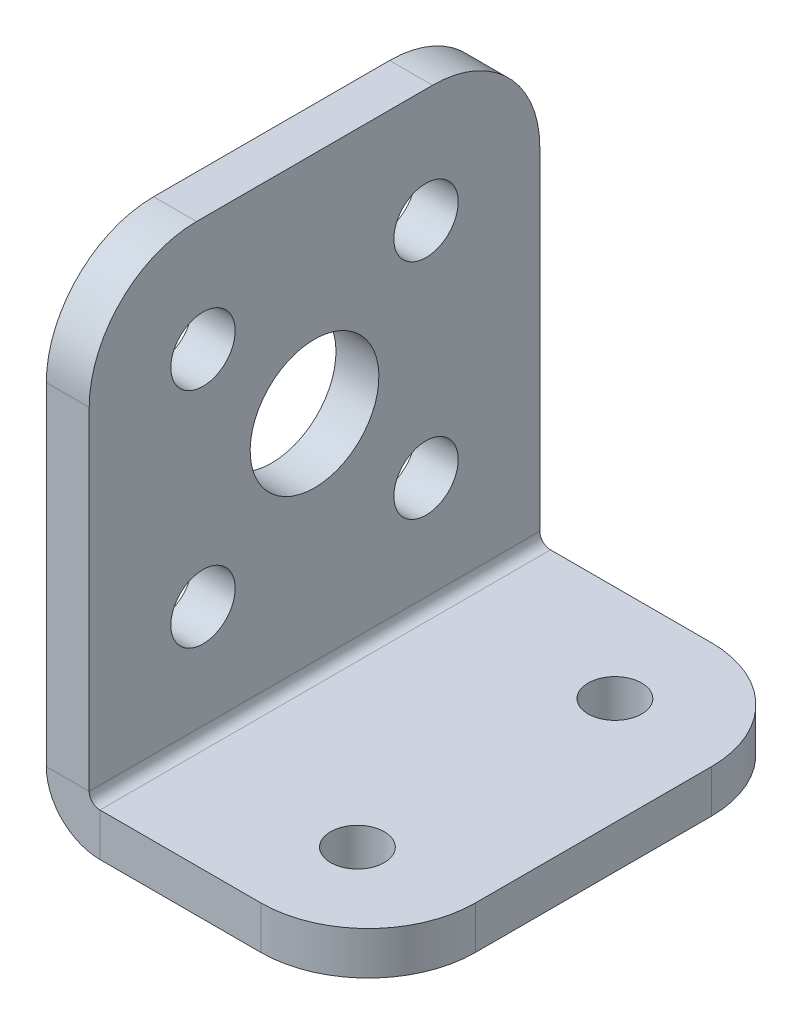
ISO-10303-21;
HEADER;
FILE_DESCRIPTION(('STEP AP214'),'2;1');
FILE_NAME('part.step','',(''),(''),'','','');
FILE_SCHEMA(('AUTOMOTIVE_DESIGN { 1 0 10303 214 1 1 1 1 }'));
ENDSEC;
DATA;
#1=APPLICATION_CONTEXT('core data for automotive mechanical design processes');
#2=APPLICATION_PROTOCOL_DEFINITION('international standard','automotive_design',2000,#1);
#3=PRODUCT_CONTEXT('',#1,'mechanical');
#4=PRODUCT('Part','Part','',(#3));
#5=PRODUCT_RELATED_PRODUCT_CATEGORY('part','',(#4));
#6=PRODUCT_DEFINITION_FORMATION('','',#4);
#7=PRODUCT_DEFINITION_CONTEXT('part definition',#1,'design');
#8=PRODUCT_DEFINITION('design','',#6,#7);
#9=PRODUCT_DEFINITION_SHAPE('','',#8);
#10=(LENGTH_UNIT() NAMED_UNIT(*) SI_UNIT(.MILLI.,.METRE.));
#11=(NAMED_UNIT(*) PLANE_ANGLE_UNIT() SI_UNIT($,.RADIAN.));
#12=(NAMED_UNIT(*) SI_UNIT($,.STERADIAN.) SOLID_ANGLE_UNIT());
#13=UNCERTAINTY_MEASURE_WITH_UNIT(LENGTH_MEASURE(1.E-05),#10,'distance_accuracy_value','');
#14=(GEOMETRIC_REPRESENTATION_CONTEXT(3) GLOBAL_UNCERTAINTY_ASSIGNED_CONTEXT((#13)) GLOBAL_UNIT_ASSIGNED_CONTEXT((#10,
#11,#12)) REPRESENTATION_CONTEXT('',''));
#15=CARTESIAN_POINT('',(0.,0.,0.));
#16=DIRECTION('',(0.,0.,1.));
#17=DIRECTION('',(1.,0.,0.));
#18=AXIS2_PLACEMENT_3D('',#15,#16,#17);
#19=CARTESIAN_POINT('',(-2.,10.25,10.5));
#20=DIRECTION('',(0.,0.,1.));
#21=DIRECTION('',(0.,-1.,0.));
#22=AXIS2_PLACEMENT_3D('',#19,#20,#21);
#23=PLANE('',#22);
#24=DIRECTION('',(0.,-1.,0.));
#25=VECTOR('',#24,1.);
#26=CARTESIAN_POINT('',(0.,10.25,10.5));
#27=LINE('',#26,#25);
#28=CARTESIAN_POINT('',(0.,5.25,10.5));
#29=VERTEX_POINT('',#28);
#30=CARTESIAN_POINT('',(0.,-10.25,10.5));
#31=VERTEX_POINT('',#30);
#32=EDGE_CURVE('E200',#29,#31,#27,.T.);
#33=ORIENTED_EDGE('',*,*,#32,.F.);
#34=DIRECTION('',(1.,0.,0.));
#35=VECTOR('',#34,1.);
#36=CARTESIAN_POINT('',(-2.,5.25,10.5));
#37=LINE('',#36,#35);
#38=CARTESIAN_POINT('',(-2.,5.25,10.5));
#39=VERTEX_POINT('',#38);
#40=EDGE_CURVE('E231',#29,#39,#37,.F.);
#41=ORIENTED_EDGE('',*,*,#40,.T.);
#42=DIRECTION('',(0.,-1.,0.));
#43=VECTOR('',#42,1.);
#44=CARTESIAN_POINT('',(-2.,10.25,10.5));
#45=LINE('',#44,#43);
#46=CARTESIAN_POINT('',(-2.,-10.25,10.5));
#47=VERTEX_POINT('',#46);
#48=EDGE_CURVE('E206',#39,#47,#45,.T.);
#49=ORIENTED_EDGE('',*,*,#48,.T.);
#50=DIRECTION('',(1.,0.,0.));
#51=VECTOR('',#50,1.);
#52=CARTESIAN_POINT('',(-2.,-10.25,10.5));
#53=LINE('',#52,#51);
#54=EDGE_CURVE('E218',#47,#31,#53,.T.);
#55=ORIENTED_EDGE('',*,*,#54,.T.);
#56=EDGE_LOOP('',(#33,#41,#49,#55));
#57=FACE_BOUND('',#56,.T.);
#58=ADVANCED_FACE('F54',(#57),#23,.T.);
#59=CARTESIAN_POINT('',(-2.,10.25,-10.5));
#60=DIRECTION('',(0.,1.,0.));
#61=DIRECTION('',(0.,0.,1.));
#62=AXIS2_PLACEMENT_3D('',#59,#60,#61);
#63=PLANE('',#62);
#64=DIRECTION('',(0.,0.,1.));
#65=VECTOR('',#64,1.);
#66=CARTESIAN_POINT('',(-2.,10.25,-10.5));
#67=LINE('',#66,#65);
#68=CARTESIAN_POINT('',(-2.,10.25,-5.49999999999999));
#69=VERTEX_POINT('',#68);
#70=CARTESIAN_POINT('',(-2.,10.25,5.5));
#71=VERTEX_POINT('',#70);
#72=EDGE_CURVE('E203',#69,#71,#67,.T.);
#73=ORIENTED_EDGE('',*,*,#72,.T.);
#74=DIRECTION('',(1.,0.,0.));
#75=VECTOR('',#74,1.);
#76=CARTESIAN_POINT('',(-2.,10.25,5.50000000000001));
#77=LINE('',#76,#75);
#78=CARTESIAN_POINT('',(0.,10.25,5.5));
#79=VERTEX_POINT('',#78);
#80=EDGE_CURVE('E224',#71,#79,#77,.T.);
#81=ORIENTED_EDGE('',*,*,#80,.T.);
#82=DIRECTION('',(0.,0.,1.));
#83=VECTOR('',#82,1.);
#84=CARTESIAN_POINT('',(0.,10.25,-10.5));
#85=LINE('',#84,#83);
#86=CARTESIAN_POINT('',(0.,10.25,-5.49999999999999));
#87=VERTEX_POINT('',#86);
#88=EDGE_CURVE('E214',#87,#79,#85,.T.);
#89=ORIENTED_EDGE('',*,*,#88,.F.);
#90=DIRECTION('',(1.,0.,0.));
#91=VECTOR('',#90,1.);
#92=CARTESIAN_POINT('',(-2.,10.25,-5.49999999999999));
#93=LINE('',#92,#91);
#94=EDGE_CURVE('E221',#87,#69,#93,.F.);
#95=ORIENTED_EDGE('',*,*,#94,.T.);
#96=EDGE_LOOP('',(#73,#81,#89,#95));
#97=FACE_BOUND('',#96,.T.);
#98=ADVANCED_FACE('F294',(#97),#63,.T.);
#99=CARTESIAN_POINT('',(-2.,10.25,-10.5));
#100=DIRECTION('',(0.,0.,-1.));
#101=DIRECTION('',(0.,1.,0.));
#102=AXIS2_PLACEMENT_3D('',#99,#100,#101);
#103=PLANE('',#102);
#104=DIRECTION('',(0.,1.,0.));
#105=VECTOR('',#104,1.);
#106=CARTESIAN_POINT('',(-2.,10.25,-10.5));
#107=LINE('',#106,#105);
#108=CARTESIAN_POINT('',(-2.,-10.25,-10.5));
#109=VERTEX_POINT('',#108);
#110=CARTESIAN_POINT('',(-2.,5.25,-10.5));
#111=VERTEX_POINT('',#110);
#112=EDGE_CURVE('E199',#109,#111,#107,.T.);
#113=ORIENTED_EDGE('',*,*,#112,.T.);
#114=DIRECTION('',(1.,0.,0.));
#115=VECTOR('',#114,1.);
#116=CARTESIAN_POINT('',(-2.,5.25,-10.5));
#117=LINE('',#116,#115);
#118=CARTESIAN_POINT('',(0.,5.25,-10.5));
#119=VERTEX_POINT('',#118);
#120=EDGE_CURVE('E237',#111,#119,#117,.T.);
#121=ORIENTED_EDGE('',*,*,#120,.T.);
#122=DIRECTION('',(0.,1.,0.));
#123=VECTOR('',#122,1.);
#124=CARTESIAN_POINT('',(0.,10.25,-10.5));
#125=LINE('',#124,#123);
#126=CARTESIAN_POINT('',(0.,-10.25,-10.5));
#127=VERTEX_POINT('',#126);
#128=EDGE_CURVE('E211',#127,#119,#125,.T.);
#129=ORIENTED_EDGE('',*,*,#128,.F.);
#130=DIRECTION('',(1.,0.,0.));
#131=VECTOR('',#130,1.);
#132=CARTESIAN_POINT('',(-2.,-10.25,-10.5));
#133=LINE('',#132,#131);
#134=EDGE_CURVE('E208',#109,#127,#133,.T.);
#135=ORIENTED_EDGE('',*,*,#134,.F.);
#136=EDGE_LOOP('',(#113,#121,#129,#135));
#137=FACE_BOUND('',#136,.T.);
#138=ADVANCED_FACE('F286',(#137),#103,.T.);
#139=CARTESIAN_POINT('',(-2.,0.,0.));
#140=DIRECTION('',(1.,0.,0.));
#141=DIRECTION('',(0.,0.,-1.));
#142=AXIS2_PLACEMENT_3D('',#139,#140,#141);
#143=PLANE('',#142);
#144=CARTESIAN_POINT('',(-2.,4.94723484172118,-5.19723484172109));
#145=DIRECTION('',(-1.,0.,0.));
#146=DIRECTION('',(0.,-1.,0.));
#147=AXIS2_PLACEMENT_3D('',#144,#145,#146);
#148=CIRCLE('',#147,1.4999999999996);
#149=CARTESIAN_POINT('',(-2.,3.44723484172158,-5.19723484172109));
#150=VERTEX_POINT('',#149);
#151=EDGE_CURVE('E384',#150,#150,#148,.T.);
#152=ORIENTED_EDGE('',*,*,#151,.F.);
#153=EDGE_LOOP('',(#152));
#154=FACE_BOUND('',#153,.T.);
#155=CARTESIAN_POINT('',(-2.,-5.44723484172109,-5.19723484172115));
#156=DIRECTION('',(-1.,0.,0.));
#157=DIRECTION('',(0.,-1.,0.));
#158=AXIS2_PLACEMENT_3D('',#155,#156,#157);
#159=CIRCLE('',#158,1.49999999999832);
#160=CARTESIAN_POINT('',(-2.,-6.94723484171941,-5.19723484172115));
#161=VERTEX_POINT('',#160);
#162=EDGE_CURVE('E408',#161,#161,#159,.T.);
#163=ORIENTED_EDGE('',*,*,#162,.F.);
#164=EDGE_LOOP('',(#163));
#165=FACE_BOUND('',#164,.T.);
#166=CARTESIAN_POINT('',(-2.,-5.44723484172111,5.19723484172111));
#167=DIRECTION('',(-1.,0.,0.));
#168=DIRECTION('',(0.,-1.,0.));
#169=AXIS2_PLACEMENT_3D('',#166,#167,#168);
#170=CIRCLE('',#169,1.49999999999871);
#171=CARTESIAN_POINT('',(-2.,-6.94723484171982,5.19723484172111));
#172=VERTEX_POINT('',#171);
#173=EDGE_CURVE('E402',#172,#172,#170,.T.);
#174=ORIENTED_EDGE('',*,*,#173,.F.);
#175=EDGE_LOOP('',(#174));
#176=FACE_BOUND('',#175,.T.);
#177=CARTESIAN_POINT('',(-2.,4.94723484172116,5.1972348417211));
#178=DIRECTION('',(-1.,0.,0.));
#179=DIRECTION('',(0.,-1.,0.));
#180=AXIS2_PLACEMENT_3D('',#177,#178,#179);
#181=CIRCLE('',#180,1.5);
#182=CARTESIAN_POINT('',(-2.,3.44723484172116,5.1972348417211));
#183=VERTEX_POINT('',#182);
#184=EDGE_CURVE('E396',#183,#183,#181,.T.);
#185=ORIENTED_EDGE('',*,*,#184,.F.);
#186=EDGE_LOOP('',(#185));
#187=FACE_BOUND('',#186,.T.);
#188=CARTESIAN_POINT('',(-2.,-0.249999999999993,0.));
#189=DIRECTION('',(-1.,0.,0.));
#190=DIRECTION('',(0.,-1.,0.));
#191=AXIS2_PLACEMENT_3D('',#188,#189,#190);
#192=CIRCLE('',#191,3.);
#193=CARTESIAN_POINT('',(-2.,-3.24999999999999,0.));
#194=VERTEX_POINT('',#193);
#195=EDGE_CURVE('E395',#194,#194,#192,.T.);
#196=ORIENTED_EDGE('',*,*,#195,.F.);
#197=EDGE_LOOP('',(#196));
#198=FACE_BOUND('',#197,.T.);
#199=ORIENTED_EDGE('',*,*,#48,.F.);
#200=CARTESIAN_POINT('',(-2.,5.25,5.50000000000001));
#201=DIRECTION('',(1.,0.,0.));
#202=DIRECTION('',(0.,0.,-1.));
#203=AXIS2_PLACEMENT_3D('',#200,#201,#202);
#204=CIRCLE('',#203,5.);
#205=EDGE_CURVE('E235',#39,#71,#204,.F.);
#206=ORIENTED_EDGE('',*,*,#205,.T.);
#207=ORIENTED_EDGE('',*,*,#72,.F.);
#208=CARTESIAN_POINT('',(-2.,5.25,-5.49999999999999));
#209=DIRECTION('',(1.,0.,0.));
#210=DIRECTION('',(0.,0.,-1.));
#211=AXIS2_PLACEMENT_3D('',#208,#209,#210);
#212=CIRCLE('',#211,5.);
#213=EDGE_CURVE('E233',#69,#111,#212,.F.);
#214=ORIENTED_EDGE('',*,*,#213,.T.);
#215=ORIENTED_EDGE('',*,*,#112,.F.);
#216=DIRECTION('',(0.,0.,-1.));
#217=VECTOR('',#216,1.);
#218=CARTESIAN_POINT('',(-2.,-10.25,-10.5));
#219=LINE('',#218,#217);
#220=EDGE_CURVE('E155',#47,#109,#219,.T.);
#221=ORIENTED_EDGE('',*,*,#220,.F.);
#222=EDGE_LOOP('',(#199,#206,#207,#214,#215,#221));
#223=FACE_BOUND('',#222,.T.);
#224=ADVANCED_FACE('F280',(#154,#165,#176,#187,#198,#223),#143,.F.);
#225=CARTESIAN_POINT('',(0.,0.,0.));
#226=DIRECTION('',(1.,0.,0.));
#227=DIRECTION('',(0.,0.,-1.));
#228=AXIS2_PLACEMENT_3D('',#225,#226,#227);
#229=PLANE('',#228);
#230=CARTESIAN_POINT('',(0.,4.94723484172118,-5.19723484172109));
#231=DIRECTION('',(-1.,0.,0.));
#232=DIRECTION('',(0.,-1.,0.));
#233=AXIS2_PLACEMENT_3D('',#230,#231,#232);
#234=CIRCLE('',#233,1.4999999999996);
#235=CARTESIAN_POINT('',(0.,3.44723484172158,-5.19723484172109));
#236=VERTEX_POINT('',#235);
#237=EDGE_CURVE('E411',#236,#236,#234,.T.);
#238=ORIENTED_EDGE('',*,*,#237,.T.);
#239=EDGE_LOOP('',(#238));
#240=FACE_BOUND('',#239,.T.);
#241=CARTESIAN_POINT('',(0.,-5.44723484172109,-5.19723484172115));
#242=DIRECTION('',(-1.,0.,0.));
#243=DIRECTION('',(0.,-1.,0.));
#244=AXIS2_PLACEMENT_3D('',#241,#242,#243);
#245=CIRCLE('',#244,1.49999999999832);
#246=CARTESIAN_POINT('',(0.,-6.94723484171941,-5.19723484172115));
#247=VERTEX_POINT('',#246);
#248=EDGE_CURVE('E405',#247,#247,#245,.T.);
#249=ORIENTED_EDGE('',*,*,#248,.T.);
#250=EDGE_LOOP('',(#249));
#251=FACE_BOUND('',#250,.T.);
#252=CARTESIAN_POINT('',(0.,-5.44723484172111,5.19723484172111));
#253=DIRECTION('',(-1.,0.,0.));
#254=DIRECTION('',(0.,-1.,0.));
#255=AXIS2_PLACEMENT_3D('',#252,#253,#254);
#256=CIRCLE('',#255,1.49999999999871);
#257=CARTESIAN_POINT('',(0.,-6.94723484171982,5.19723484172111));
#258=VERTEX_POINT('',#257);
#259=EDGE_CURVE('E399',#258,#258,#256,.T.);
#260=ORIENTED_EDGE('',*,*,#259,.T.);
#261=EDGE_LOOP('',(#260));
#262=FACE_BOUND('',#261,.T.);
#263=CARTESIAN_POINT('',(0.,4.94723484172116,5.1972348417211));
#264=DIRECTION('',(-1.,0.,0.));
#265=DIRECTION('',(0.,-1.,0.));
#266=AXIS2_PLACEMENT_3D('',#263,#264,#265);
#267=CIRCLE('',#266,1.5);
#268=CARTESIAN_POINT('',(0.,3.44723484172116,5.1972348417211));
#269=VERTEX_POINT('',#268);
#270=EDGE_CURVE('E392',#269,#269,#267,.T.);
#271=ORIENTED_EDGE('',*,*,#270,.T.);
#272=EDGE_LOOP('',(#271));
#273=FACE_BOUND('',#272,.T.);
#274=CARTESIAN_POINT('',(0.,-0.249999999999993,0.));
#275=DIRECTION('',(-1.,0.,0.));
#276=DIRECTION('',(0.,-1.,0.));
#277=AXIS2_PLACEMENT_3D('',#274,#275,#276);
#278=CIRCLE('',#277,3.);
#279=CARTESIAN_POINT('',(0.,-3.24999999999999,0.));
#280=VERTEX_POINT('',#279);
#281=EDGE_CURVE('E192',#280,#280,#278,.T.);
#282=ORIENTED_EDGE('',*,*,#281,.T.);
#283=EDGE_LOOP('',(#282));
#284=FACE_BOUND('',#283,.T.);
#285=ORIENTED_EDGE('',*,*,#88,.T.);
#286=CARTESIAN_POINT('',(0.,5.25,5.50000000000001));
#287=DIRECTION('',(1.,0.,0.));
#288=DIRECTION('',(0.,0.,-1.));
#289=AXIS2_PLACEMENT_3D('',#286,#287,#288);
#290=CIRCLE('',#289,5.);
#291=EDGE_CURVE('E229',#79,#29,#290,.T.);
#292=ORIENTED_EDGE('',*,*,#291,.T.);
#293=ORIENTED_EDGE('',*,*,#32,.T.);
#294=DIRECTION('',(0.,0.,-1.));
#295=VECTOR('',#294,1.);
#296=CARTESIAN_POINT('',(0.,-10.25,-10.5));
#297=LINE('',#296,#295);
#298=EDGE_CURVE('E193',#31,#127,#297,.T.);
#299=ORIENTED_EDGE('',*,*,#298,.T.);
#300=ORIENTED_EDGE('',*,*,#128,.T.);
#301=CARTESIAN_POINT('',(0.,5.25,-5.49999999999999));
#302=DIRECTION('',(1.,0.,0.));
#303=DIRECTION('',(0.,0.,-1.));
#304=AXIS2_PLACEMENT_3D('',#301,#302,#303);
#305=CIRCLE('',#304,5.);
#306=EDGE_CURVE('E227',#119,#87,#305,.T.);
#307=ORIENTED_EDGE('',*,*,#306,.T.);
#308=EDGE_LOOP('',(#285,#292,#293,#299,#300,#307));
#309=FACE_BOUND('',#308,.T.);
#310=ADVANCED_FACE('F288',(#240,#251,#262,#273,#284,#309),#229,.T.);
#311=CARTESIAN_POINT('',(0.5,-10.25,10.5));
#312=DIRECTION('',(0.,0.,1.));
#313=DIRECTION('',(1.,0.,0.));
#314=AXIS2_PLACEMENT_3D('',#311,#312,#313);
#315=PLANE('',#314);
#316=DIRECTION('',(0.,1.,0.));
#317=VECTOR('',#316,1.);
#318=CARTESIAN_POINT('',(0.499999999999992,-12.75,10.5));
#319=LINE('',#318,#317);
#320=CARTESIAN_POINT('',(0.499999999999999,-10.75,10.5));
#321=VERTEX_POINT('',#320);
#322=CARTESIAN_POINT('',(0.499999999999992,-12.75,10.5));
#323=VERTEX_POINT('',#322);
#324=EDGE_CURVE('E189',#321,#323,#319,.F.);
#325=ORIENTED_EDGE('',*,*,#324,.F.);
#326=CARTESIAN_POINT('',(0.5,-10.25,10.5));
#327=DIRECTION('',(0.,0.,-1.));
#328=DIRECTION('',(-1.,0.,0.));
#329=AXIS2_PLACEMENT_3D('',#326,#327,#328);
#330=CIRCLE('',#329,0.500000000000004);
#331=EDGE_CURVE('E159',#31,#321,#330,.F.);
#332=ORIENTED_EDGE('',*,*,#331,.F.);
#333=ORIENTED_EDGE('',*,*,#54,.F.);
#334=CARTESIAN_POINT('',(0.5,-10.25,10.5));
#335=DIRECTION('',(0.,0.,-1.));
#336=DIRECTION('',(-1.,0.,0.));
#337=AXIS2_PLACEMENT_3D('',#334,#335,#336);
#338=CIRCLE('',#337,2.5);
#339=EDGE_CURVE('E158',#47,#323,#338,.F.);
#340=ORIENTED_EDGE('',*,*,#339,.T.);
#341=EDGE_LOOP('',(#325,#332,#333,#340));
#342=FACE_BOUND('',#341,.T.);
#343=ADVANCED_FACE('F273',(#342),#315,.T.);
#344=CARTESIAN_POINT('',(0.5,-10.25,-10.5));
#345=DIRECTION('',(0.,0.,1.));
#346=DIRECTION('',(1.,0.,0.));
#347=AXIS2_PLACEMENT_3D('',#344,#345,#346);
#348=PLANE('',#347);
#349=CARTESIAN_POINT('',(0.5,-10.25,-10.5));
#350=DIRECTION('',(0.,0.,-1.));
#351=DIRECTION('',(-1.,0.,0.));
#352=AXIS2_PLACEMENT_3D('',#349,#350,#351);
#353=CIRCLE('',#352,0.500000000000004);
#354=CARTESIAN_POINT('',(0.499999999999999,-10.75,-10.5));
#355=VERTEX_POINT('',#354);
#356=EDGE_CURVE('E166',#355,#127,#353,.T.);
#357=ORIENTED_EDGE('',*,*,#356,.F.);
#358=DIRECTION('',(0.,1.,0.));
#359=VECTOR('',#358,1.);
#360=CARTESIAN_POINT('',(0.499999999999999,-10.75,-10.5));
#361=LINE('',#360,#359);
#362=CARTESIAN_POINT('',(0.499999999999992,-12.75,-10.5));
#363=VERTEX_POINT('',#362);
#364=EDGE_CURVE('E163',#355,#363,#361,.F.);
#365=ORIENTED_EDGE('',*,*,#364,.T.);
#366=CARTESIAN_POINT('',(0.5,-10.25,-10.5));
#367=DIRECTION('',(0.,0.,-1.));
#368=DIRECTION('',(-1.,0.,0.));
#369=AXIS2_PLACEMENT_3D('',#366,#367,#368);
#370=CIRCLE('',#369,2.5);
#371=EDGE_CURVE('E147',#363,#109,#370,.T.);
#372=ORIENTED_EDGE('',*,*,#371,.T.);
#373=ORIENTED_EDGE('',*,*,#134,.T.);
#374=EDGE_LOOP('',(#357,#365,#372,#373));
#375=FACE_BOUND('',#374,.T.);
#376=ADVANCED_FACE('F164',(#375),#348,.F.);
#377=CARTESIAN_POINT('',(0.5,-10.25,-10.5));
#378=DIRECTION('',(0.,0.,-1.));
#379=DIRECTION('',(0.,-1.,0.));
#380=AXIS2_PLACEMENT_3D('',#377,#378,#379);
#381=CYLINDRICAL_SURFACE('',#380,2.5);
#382=ORIENTED_EDGE('',*,*,#220,.T.);
#383=ORIENTED_EDGE('',*,*,#371,.F.);
#384=DIRECTION('',(0.,0.,-1.));
#385=VECTOR('',#384,1.);
#386=CARTESIAN_POINT('',(0.499999999999992,-12.75,10.5));
#387=LINE('',#386,#385);
#388=EDGE_CURVE('E152',#363,#323,#387,.F.);
#389=ORIENTED_EDGE('',*,*,#388,.T.);
#390=ORIENTED_EDGE('',*,*,#339,.F.);
#391=EDGE_LOOP('',(#382,#383,#389,#390));
#392=FACE_BOUND('',#391,.T.);
#393=ADVANCED_FACE('F149',(#392),#381,.T.);
#394=CARTESIAN_POINT('',(0.5,-10.25,-10.5));
#395=DIRECTION('',(0.,0.,-1.));
#396=DIRECTION('',(0.,-1.,0.));
#397=AXIS2_PLACEMENT_3D('',#394,#395,#396);
#398=CYLINDRICAL_SURFACE('',#397,0.500000000000004);
#399=ORIENTED_EDGE('',*,*,#298,.F.);
#400=ORIENTED_EDGE('',*,*,#331,.T.);
#401=DIRECTION('',(0.,0.,-1.));
#402=VECTOR('',#401,1.);
#403=CARTESIAN_POINT('',(0.499999999999999,-10.75,10.5));
#404=LINE('',#403,#402);
#405=EDGE_CURVE('E168',#321,#355,#404,.T.);
#406=ORIENTED_EDGE('',*,*,#405,.T.);
#407=ORIENTED_EDGE('',*,*,#356,.T.);
#408=EDGE_LOOP('',(#399,#400,#406,#407));
#409=FACE_BOUND('',#408,.T.);
#410=ADVANCED_FACE('F269',(#409),#398,.F.);
#411=CARTESIAN_POINT('',(13.,-12.75,-10.5));
#412=DIRECTION('',(0.,0.,1.));
#413=DIRECTION('',(0.,-1.,0.));
#414=AXIS2_PLACEMENT_3D('',#411,#412,#413);
#415=PLANE('',#414);
#416=DIRECTION('',(-1.,0.,0.));
#417=VECTOR('',#416,1.);
#418=CARTESIAN_POINT('',(13.,-10.75,-10.5));
#419=LINE('',#418,#417);
#420=CARTESIAN_POINT('',(8.,-10.75,-10.5));
#421=VERTEX_POINT('',#420);
#422=EDGE_CURVE('E174',#355,#421,#419,.F.);
#423=ORIENTED_EDGE('',*,*,#422,.T.);
#424=DIRECTION('',(0.,1.,0.));
#425=VECTOR('',#424,1.);
#426=CARTESIAN_POINT('',(7.99999999999999,-12.75,-10.5));
#427=LINE('',#426,#425);
#428=CARTESIAN_POINT('',(7.99999999999999,-12.75,-10.5));
#429=VERTEX_POINT('',#428);
#430=EDGE_CURVE('E77',#421,#429,#427,.F.);
#431=ORIENTED_EDGE('',*,*,#430,.T.);
#432=DIRECTION('',(1.,0.,0.));
#433=VECTOR('',#432,1.);
#434=CARTESIAN_POINT('',(0.,-12.75,-10.5));
#435=LINE('',#434,#433);
#436=EDGE_CURVE('E171',#363,#429,#435,.T.);
#437=ORIENTED_EDGE('',*,*,#436,.F.);
#438=ORIENTED_EDGE('',*,*,#364,.F.);
#439=EDGE_LOOP('',(#423,#431,#437,#438));
#440=FACE_BOUND('',#439,.T.);
#441=ADVANCED_FACE('F176',(#440),#415,.F.);
#442=CARTESIAN_POINT('',(0.,-12.75,10.5));
#443=DIRECTION('',(0.,0.,-1.));
#444=DIRECTION('',(0.,1.,0.));
#445=AXIS2_PLACEMENT_3D('',#442,#443,#444);
#446=PLANE('',#445);
#447=DIRECTION('',(-1.,0.,0.));
#448=VECTOR('',#447,1.);
#449=CARTESIAN_POINT('',(0.,-12.75,10.5));
#450=LINE('',#449,#448);
#451=CARTESIAN_POINT('',(7.99999999999999,-12.75,10.5));
#452=VERTEX_POINT('',#451);
#453=EDGE_CURVE('E173',#452,#323,#450,.T.);
#454=ORIENTED_EDGE('',*,*,#453,.F.);
#455=DIRECTION('',(0.,1.,0.));
#456=VECTOR('',#455,1.);
#457=CARTESIAN_POINT('',(7.99999999999999,-12.75,10.5));
#458=LINE('',#457,#456);
#459=CARTESIAN_POINT('',(8.,-10.75,10.5));
#460=VERTEX_POINT('',#459);
#461=EDGE_CURVE('E13',#452,#460,#458,.T.);
#462=ORIENTED_EDGE('',*,*,#461,.T.);
#463=DIRECTION('',(1.,0.,0.));
#464=VECTOR('',#463,1.);
#465=CARTESIAN_POINT('',(0.,-10.75,10.5));
#466=LINE('',#465,#464);
#467=EDGE_CURVE('E178',#460,#321,#466,.F.);
#468=ORIENTED_EDGE('',*,*,#467,.T.);
#469=ORIENTED_EDGE('',*,*,#324,.T.);
#470=EDGE_LOOP('',(#454,#462,#468,#469));
#471=FACE_BOUND('',#470,.T.);
#472=ADVANCED_FACE('F265',(#471),#446,.F.);
#473=CARTESIAN_POINT('',(0.,-12.75,0.));
#474=DIRECTION('',(0.,1.,0.));
#475=DIRECTION('',(-1.,0.,0.));
#476=AXIS2_PLACEMENT_3D('',#473,#474,#475);
#477=PLANE('',#476);
#478=CARTESIAN_POINT('',(7.99999999999999,-12.75,-6.00000000000001));
#479=DIRECTION('',(0.,-1.,0.));
#480=DIRECTION('',(1.,0.,0.));
#481=AXIS2_PLACEMENT_3D('',#478,#479,#480);
#482=CIRCLE('',#481,1.25);
#483=CARTESIAN_POINT('',(9.24999999999999,-12.75,-6.00000000000001));
#484=VERTEX_POINT('',#483);
#485=EDGE_CURVE('E381',#484,#484,#482,.T.);
#486=ORIENTED_EDGE('',*,*,#485,.F.);
#487=EDGE_LOOP('',(#486));
#488=FACE_BOUND('',#487,.T.);
#489=CARTESIAN_POINT('',(8.,-12.75,6.));
#490=DIRECTION('',(0.,-1.,0.));
#491=DIRECTION('',(-1.,0.,0.));
#492=AXIS2_PLACEMENT_3D('',#489,#490,#491);
#493=CIRCLE('',#492,1.25);
#494=CARTESIAN_POINT('',(6.75,-12.75,6.));
#495=VERTEX_POINT('',#494);
#496=EDGE_CURVE('E387',#495,#495,#493,.T.);
#497=ORIENTED_EDGE('',*,*,#496,.F.);
#498=EDGE_LOOP('',(#497));
#499=FACE_BOUND('',#498,.T.);
#500=ORIENTED_EDGE('',*,*,#436,.T.);
#501=CARTESIAN_POINT('',(7.99999999999999,-12.75,-5.5));
#502=DIRECTION('',(0.,1.,0.));
#503=DIRECTION('',(-1.,0.,0.));
#504=AXIS2_PLACEMENT_3D('',#501,#502,#503);
#505=CIRCLE('',#504,5.);
#506=CARTESIAN_POINT('',(13.,-12.75,-5.5));
#507=VERTEX_POINT('',#506);
#508=EDGE_CURVE('E62',#429,#507,#505,.F.);
#509=ORIENTED_EDGE('',*,*,#508,.T.);
#510=DIRECTION('',(0.,0.,1.));
#511=VECTOR('',#510,1.);
#512=CARTESIAN_POINT('',(13.,-12.75,0.));
#513=LINE('',#512,#511);
#514=CARTESIAN_POINT('',(13.,-12.75,5.49999999999999));
#515=VERTEX_POINT('',#514);
#516=EDGE_CURVE('E177',#507,#515,#513,.T.);
#517=ORIENTED_EDGE('',*,*,#516,.T.);
#518=CARTESIAN_POINT('',(7.99999999999999,-12.75,5.49999999999999));
#519=DIRECTION('',(0.,1.,0.));
#520=DIRECTION('',(-1.,0.,0.));
#521=AXIS2_PLACEMENT_3D('',#518,#519,#520);
#522=CIRCLE('',#521,5.);
#523=EDGE_CURVE('E69',#515,#452,#522,.F.);
#524=ORIENTED_EDGE('',*,*,#523,.T.);
#525=ORIENTED_EDGE('',*,*,#453,.T.);
#526=ORIENTED_EDGE('',*,*,#388,.F.);
#527=EDGE_LOOP('',(#500,#509,#517,#524,#525,#526));
#528=FACE_BOUND('',#527,.T.);
#529=ADVANCED_FACE('F170',(#488,#499,#528),#477,.F.);
#530=CARTESIAN_POINT('',(0.,-10.75,0.));
#531=DIRECTION('',(0.,1.,0.));
#532=DIRECTION('',(-1.,0.,0.));
#533=AXIS2_PLACEMENT_3D('',#530,#531,#532);
#534=PLANE('',#533);
#535=CARTESIAN_POINT('',(8.,-10.75,-6.00000000000001));
#536=DIRECTION('',(0.,-1.,0.));
#537=DIRECTION('',(1.,0.,0.));
#538=AXIS2_PLACEMENT_3D('',#535,#536,#537);
#539=CIRCLE('',#538,1.25);
#540=CARTESIAN_POINT('',(9.25,-10.75,-6.00000000000001));
#541=VERTEX_POINT('',#540);
#542=EDGE_CURVE('E378',#541,#541,#539,.T.);
#543=ORIENTED_EDGE('',*,*,#542,.T.);
#544=EDGE_LOOP('',(#543));
#545=FACE_BOUND('',#544,.T.);
#546=CARTESIAN_POINT('',(8.00000000000001,-10.75,6.));
#547=DIRECTION('',(0.,-1.,0.));
#548=DIRECTION('',(-1.,0.,0.));
#549=AXIS2_PLACEMENT_3D('',#546,#547,#548);
#550=CIRCLE('',#549,1.25);
#551=CARTESIAN_POINT('',(6.75000000000001,-10.75,6.));
#552=VERTEX_POINT('',#551);
#553=EDGE_CURVE('E382',#552,#552,#550,.T.);
#554=ORIENTED_EDGE('',*,*,#553,.T.);
#555=EDGE_LOOP('',(#554));
#556=FACE_BOUND('',#555,.T.);
#557=DIRECTION('',(0.,0.,-1.));
#558=VECTOR('',#557,1.);
#559=CARTESIAN_POINT('',(13.,-10.75,10.5));
#560=LINE('',#559,#558);
#561=CARTESIAN_POINT('',(13.,-10.75,-5.5));
#562=VERTEX_POINT('',#561);
#563=CARTESIAN_POINT('',(13.,-10.75,5.5));
#564=VERTEX_POINT('',#563);
#565=EDGE_CURVE('E181',#562,#564,#560,.F.);
#566=ORIENTED_EDGE('',*,*,#565,.F.);
#567=CARTESIAN_POINT('',(8.,-10.75,-5.5));
#568=DIRECTION('',(0.,1.,0.));
#569=DIRECTION('',(-1.,0.,0.));
#570=AXIS2_PLACEMENT_3D('',#567,#568,#569);
#571=CIRCLE('',#570,5.);
#572=EDGE_CURVE('E247',#562,#421,#571,.T.);
#573=ORIENTED_EDGE('',*,*,#572,.T.);
#574=ORIENTED_EDGE('',*,*,#422,.F.);
#575=ORIENTED_EDGE('',*,*,#405,.F.);
#576=ORIENTED_EDGE('',*,*,#467,.F.);
#577=CARTESIAN_POINT('',(8.,-10.75,5.5));
#578=DIRECTION('',(0.,1.,0.));
#579=DIRECTION('',(-1.,0.,0.));
#580=AXIS2_PLACEMENT_3D('',#577,#578,#579);
#581=CIRCLE('',#580,5.);
#582=EDGE_CURVE('E245',#460,#564,#581,.T.);
#583=ORIENTED_EDGE('',*,*,#582,.T.);
#584=EDGE_LOOP('',(#566,#573,#574,#575,#576,#583));
#585=FACE_BOUND('',#584,.T.);
#586=ADVANCED_FACE('F259',(#545,#556,#585),#534,.T.);
#587=CARTESIAN_POINT('',(13.,-12.75,10.5));
#588=DIRECTION('',(-1.,0.,0.));
#589=DIRECTION('',(0.,-1.,0.));
#590=AXIS2_PLACEMENT_3D('',#587,#588,#589);
#591=PLANE('',#590);
#592=ORIENTED_EDGE('',*,*,#516,.F.);
#593=DIRECTION('',(0.,1.,0.));
#594=VECTOR('',#593,1.);
#595=CARTESIAN_POINT('',(13.,-12.75,-5.5));
#596=LINE('',#595,#594);
#597=EDGE_CURVE('E242',#507,#562,#596,.T.);
#598=ORIENTED_EDGE('',*,*,#597,.T.);
#599=ORIENTED_EDGE('',*,*,#565,.T.);
#600=DIRECTION('',(0.,1.,0.));
#601=VECTOR('',#600,1.);
#602=CARTESIAN_POINT('',(13.,-12.75,5.49999999999999));
#603=LINE('',#602,#601);
#604=EDGE_CURVE('E240',#564,#515,#603,.F.);
#605=ORIENTED_EDGE('',*,*,#604,.T.);
#606=EDGE_LOOP('',(#592,#598,#599,#605));
#607=FACE_BOUND('',#606,.T.);
#608=ADVANCED_FACE('F254',(#607),#591,.F.);
#609=CARTESIAN_POINT('',(0.,-0.249999999999993,0.));
#610=DIRECTION('',(-1.,0.,0.));
#611=DIRECTION('',(0.,-1.,0.));
#612=AXIS2_PLACEMENT_3D('',#609,#610,#611);
#613=CYLINDRICAL_SURFACE('',#612,3.);
#614=ORIENTED_EDGE('',*,*,#281,.F.);
#615=EDGE_LOOP('',(#614));
#616=FACE_BOUND('',#615,.T.);
#617=ORIENTED_EDGE('',*,*,#195,.T.);
#618=EDGE_LOOP('',(#617));
#619=FACE_BOUND('',#618,.T.);
#620=ADVANCED_FACE('F339',(#616,#619),#613,.F.);
#621=CARTESIAN_POINT('',(0.,4.94723484172116,5.1972348417211));
#622=DIRECTION('',(-1.,0.,0.));
#623=DIRECTION('',(0.,-1.,0.));
#624=AXIS2_PLACEMENT_3D('',#621,#622,#623);
#625=CYLINDRICAL_SURFACE('',#624,1.5);
#626=ORIENTED_EDGE('',*,*,#270,.F.);
#627=EDGE_LOOP('',(#626));
#628=FACE_BOUND('',#627,.T.);
#629=ORIENTED_EDGE('',*,*,#184,.T.);
#630=EDGE_LOOP('',(#629));
#631=FACE_BOUND('',#630,.T.);
#632=ADVANCED_FACE('F350',(#628,#631),#625,.F.);
#633=CARTESIAN_POINT('',(0.,-5.44723484172111,5.19723484172111));
#634=DIRECTION('',(-1.,0.,0.));
#635=DIRECTION('',(0.,-1.,0.));
#636=AXIS2_PLACEMENT_3D('',#633,#634,#635);
#637=CYLINDRICAL_SURFACE('',#636,1.49999999999871);
#638=ORIENTED_EDGE('',*,*,#259,.F.);
#639=EDGE_LOOP('',(#638));
#640=FACE_BOUND('',#639,.T.);
#641=ORIENTED_EDGE('',*,*,#173,.T.);
#642=EDGE_LOOP('',(#641));
#643=FACE_BOUND('',#642,.T.);
#644=ADVANCED_FACE('F360',(#640,#643),#637,.F.);
#645=CARTESIAN_POINT('',(0.,-5.44723484172109,-5.19723484172115));
#646=DIRECTION('',(-1.,0.,0.));
#647=DIRECTION('',(0.,-1.,0.));
#648=AXIS2_PLACEMENT_3D('',#645,#646,#647);
#649=CYLINDRICAL_SURFACE('',#648,1.49999999999832);
#650=ORIENTED_EDGE('',*,*,#248,.F.);
#651=EDGE_LOOP('',(#650));
#652=FACE_BOUND('',#651,.T.);
#653=ORIENTED_EDGE('',*,*,#162,.T.);
#654=EDGE_LOOP('',(#653));
#655=FACE_BOUND('',#654,.T.);
#656=ADVANCED_FACE('F356',(#652,#655),#649,.F.);
#657=CARTESIAN_POINT('',(0.,4.94723484172118,-5.19723484172109));
#658=DIRECTION('',(-1.,0.,0.));
#659=DIRECTION('',(0.,-1.,0.));
#660=AXIS2_PLACEMENT_3D('',#657,#658,#659);
#661=CYLINDRICAL_SURFACE('',#660,1.4999999999996);
#662=ORIENTED_EDGE('',*,*,#237,.F.);
#663=EDGE_LOOP('',(#662));
#664=FACE_BOUND('',#663,.T.);
#665=ORIENTED_EDGE('',*,*,#151,.T.);
#666=EDGE_LOOP('',(#665));
#667=FACE_BOUND('',#666,.T.);
#668=ADVANCED_FACE('F352',(#664,#667),#661,.F.);
#669=CARTESIAN_POINT('',(8.00000000000001,-10.75,6.));
#670=DIRECTION('',(0.,-1.,0.));
#671=DIRECTION('',(1.,0.,0.));
#672=AXIS2_PLACEMENT_3D('',#669,#670,#671);
#673=CYLINDRICAL_SURFACE('',#672,1.25);
#674=ORIENTED_EDGE('',*,*,#553,.F.);
#675=EDGE_LOOP('',(#674));
#676=FACE_BOUND('',#675,.T.);
#677=ORIENTED_EDGE('',*,*,#496,.T.);
#678=EDGE_LOOP('',(#677));
#679=FACE_BOUND('',#678,.T.);
#680=ADVANCED_FACE('F355',(#676,#679),#673,.F.);
#681=CARTESIAN_POINT('',(8.,-10.75,-6.00000000000001));
#682=DIRECTION('',(0.,-1.,0.));
#683=DIRECTION('',(1.,0.,0.));
#684=AXIS2_PLACEMENT_3D('',#681,#682,#683);
#685=CYLINDRICAL_SURFACE('',#684,1.25);
#686=ORIENTED_EDGE('',*,*,#542,.F.);
#687=EDGE_LOOP('',(#686));
#688=FACE_BOUND('',#687,.T.);
#689=ORIENTED_EDGE('',*,*,#485,.T.);
#690=EDGE_LOOP('',(#689));
#691=FACE_BOUND('',#690,.T.);
#692=ADVANCED_FACE('F304',(#688,#691),#685,.F.);
#693=CARTESIAN_POINT('',(-2.,5.25,5.50000000000001));
#694=DIRECTION('',(1.,0.,0.));
#695=DIRECTION('',(0.,0.,-1.));
#696=AXIS2_PLACEMENT_3D('',#693,#694,#695);
#697=CYLINDRICAL_SURFACE('',#696,5.);
#698=ORIENTED_EDGE('',*,*,#205,.F.);
#699=ORIENTED_EDGE('',*,*,#40,.F.);
#700=ORIENTED_EDGE('',*,*,#291,.F.);
#701=ORIENTED_EDGE('',*,*,#80,.F.);
#702=EDGE_LOOP('',(#698,#699,#700,#701));
#703=FACE_BOUND('',#702,.T.);
#704=ADVANCED_FACE('F292',(#703),#697,.T.);
#705=CARTESIAN_POINT('',(-2.,5.25,-5.49999999999999));
#706=DIRECTION('',(1.,0.,0.));
#707=DIRECTION('',(0.,0.,-1.));
#708=AXIS2_PLACEMENT_3D('',#705,#706,#707);
#709=CYLINDRICAL_SURFACE('',#708,5.);
#710=ORIENTED_EDGE('',*,*,#213,.F.);
#711=ORIENTED_EDGE('',*,*,#94,.F.);
#712=ORIENTED_EDGE('',*,*,#306,.F.);
#713=ORIENTED_EDGE('',*,*,#120,.F.);
#714=EDGE_LOOP('',(#710,#711,#712,#713));
#715=FACE_BOUND('',#714,.T.);
#716=ADVANCED_FACE('F297',(#715),#709,.T.);
#717=CARTESIAN_POINT('',(7.99999999999999,-12.75,-5.5));
#718=DIRECTION('',(0.,1.,0.));
#719=DIRECTION('',(-1.,0.,0.));
#720=AXIS2_PLACEMENT_3D('',#717,#718,#719);
#721=CYLINDRICAL_SURFACE('',#720,5.);
#722=ORIENTED_EDGE('',*,*,#508,.F.);
#723=ORIENTED_EDGE('',*,*,#430,.F.);
#724=ORIENTED_EDGE('',*,*,#572,.F.);
#725=ORIENTED_EDGE('',*,*,#597,.F.);
#726=EDGE_LOOP('',(#722,#723,#724,#725));
#727=FACE_BOUND('',#726,.T.);
#728=ADVANCED_FACE('F257',(#727),#721,.T.);
#729=CARTESIAN_POINT('',(7.99999999999999,-12.75,5.49999999999999));
#730=DIRECTION('',(0.,1.,0.));
#731=DIRECTION('',(-1.,0.,0.));
#732=AXIS2_PLACEMENT_3D('',#729,#730,#731);
#733=CYLINDRICAL_SURFACE('',#732,5.);
#734=ORIENTED_EDGE('',*,*,#523,.F.);
#735=ORIENTED_EDGE('',*,*,#604,.F.);
#736=ORIENTED_EDGE('',*,*,#582,.F.);
#737=ORIENTED_EDGE('',*,*,#461,.F.);
#738=EDGE_LOOP('',(#734,#735,#736,#737));
#739=FACE_BOUND('',#738,.T.);
#740=ADVANCED_FACE('F56',(#739),#733,.T.);
#741=CLOSED_SHELL('',(#58,#98,#138,#224,#310,#343,#376,#393,#410,#441,#472,#529,#586,#608,#620,
#632,#644,#656,#668,#680,#692,#704,#716,#728,#740));
#742=MANIFOLD_SOLID_BREP('B2',#741);
#743=ADVANCED_BREP_SHAPE_REPRESENTATION('',(#18,#742),#14);
#744=SHAPE_DEFINITION_REPRESENTATION(#9,#743);
ENDSEC;
END-ISO-10303-21;
